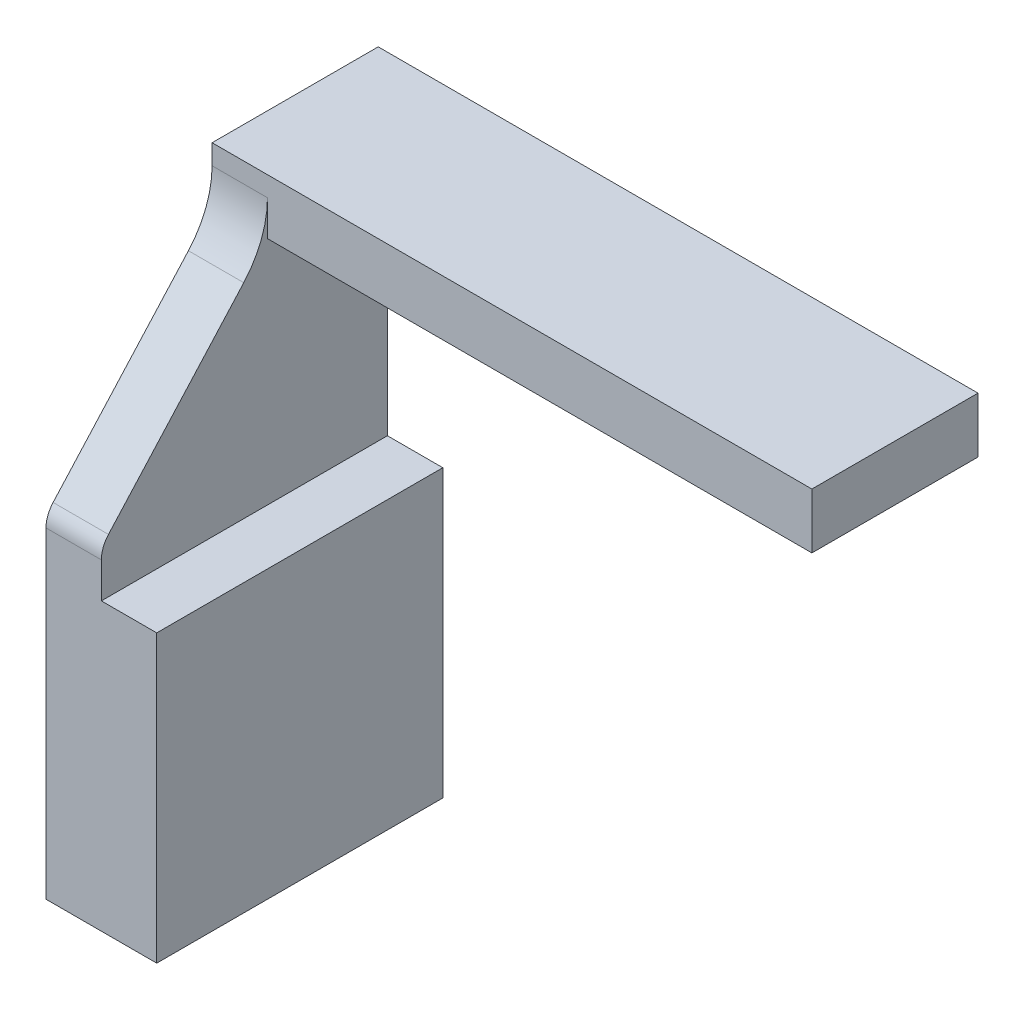
ISO-10303-21;
HEADER;
FILE_DESCRIPTION(('STEP AP214'),'2;1');
FILE_NAME('part.step','',(''),(''),'','','');
FILE_SCHEMA(('AUTOMOTIVE_DESIGN { 1 0 10303 214 1 1 1 1 }'));
ENDSEC;
DATA;
#1=APPLICATION_CONTEXT('core data for automotive mechanical design processes');
#2=APPLICATION_PROTOCOL_DEFINITION('international standard','automotive_design',2000,#1);
#3=PRODUCT_CONTEXT('',#1,'mechanical');
#4=PRODUCT('Part','Part','',(#3));
#5=PRODUCT_RELATED_PRODUCT_CATEGORY('part','',(#4));
#6=PRODUCT_DEFINITION_FORMATION('','',#4);
#7=PRODUCT_DEFINITION_CONTEXT('part definition',#1,'design');
#8=PRODUCT_DEFINITION('design','',#6,#7);
#9=PRODUCT_DEFINITION_SHAPE('','',#8);
#10=(LENGTH_UNIT() NAMED_UNIT(*) SI_UNIT(.MILLI.,.METRE.));
#11=(NAMED_UNIT(*) PLANE_ANGLE_UNIT() SI_UNIT($,.RADIAN.));
#12=(NAMED_UNIT(*) SI_UNIT($,.STERADIAN.) SOLID_ANGLE_UNIT());
#13=UNCERTAINTY_MEASURE_WITH_UNIT(LENGTH_MEASURE(1.E-05),#10,'distance_accuracy_value','');
#14=(GEOMETRIC_REPRESENTATION_CONTEXT(3) GLOBAL_UNCERTAINTY_ASSIGNED_CONTEXT((#13)) GLOBAL_UNIT_ASSIGNED_CONTEXT((#10,
#11,#12)) REPRESENTATION_CONTEXT('',''));
#15=CARTESIAN_POINT('',(0.,0.,0.));
#16=DIRECTION('',(0.,0.,1.));
#17=DIRECTION('',(1.,0.,0.));
#18=AXIS2_PLACEMENT_3D('',#15,#16,#17);
#19=CARTESIAN_POINT('',(-26.5,0.,0.));
#20=DIRECTION('',(1.,0.,0.));
#21=DIRECTION('',(0.,0.,-1.));
#22=AXIS2_PLACEMENT_3D('',#19,#20,#21);
#23=PLANE('',#22);
#24=DIRECTION('',(0.,1.,0.));
#25=VECTOR('',#24,1.);
#26=CARTESIAN_POINT('',(-26.5,-56.,27.));
#27=LINE('',#26,#25);
#28=CARTESIAN_POINT('',(-26.5,-25.,27.));
#29=VERTEX_POINT('',#28);
#30=CARTESIAN_POINT('',(-26.5,-21.1512080156912,27.));
#31=VERTEX_POINT('',#30);
#32=EDGE_CURVE('E171',#29,#31,#27,.T.);
#33=ORIENTED_EDGE('',*,*,#32,.F.);
#34=DIRECTION('',(0.,0.,1.));
#35=VECTOR('',#34,1.);
#36=CARTESIAN_POINT('',(-26.5,-25.,-4.));
#37=LINE('',#36,#35);
#38=CARTESIAN_POINT('',(-26.5,-25.,-4.));
#39=VERTEX_POINT('',#38);
#40=EDGE_CURVE('E158',#39,#29,#37,.T.);
#41=ORIENTED_EDGE('',*,*,#40,.F.);
#42=DIRECTION('',(0.,-1.,0.));
#43=VECTOR('',#42,1.);
#44=CARTESIAN_POINT('',(-26.5,-5.,-4.));
#45=LINE('',#44,#43);
#46=CARTESIAN_POINT('',(-26.5,-6.24264068711929,-4.));
#47=VERTEX_POINT('',#46);
#48=EDGE_CURVE('E161',#47,#39,#45,.T.);
#49=ORIENTED_EDGE('',*,*,#48,.F.);
#50=CARTESIAN_POINT('',(-26.5,-6.24264068711929,-7.));
#51=DIRECTION('',(1.,0.,0.));
#52=DIRECTION('',(0.,0.,-1.));
#53=AXIS2_PLACEMENT_3D('',#50,#51,#52);
#54=CIRCLE('',#53,3.);
#55=CARTESIAN_POINT('',(-26.5,-4.12132034355965,-4.87867965644036));
#56=VERTEX_POINT('',#55);
#57=EDGE_CURVE('E11',#47,#56,#54,.F.);
#58=ORIENTED_EDGE('',*,*,#57,.T.);
#59=DIRECTION('',(0.,-0.707106781186548,0.707106781186547));
#60=VECTOR('',#59,1.);
#61=CARTESIAN_POINT('',(-26.5,0.,-9.));
#62=LINE('',#61,#60);
#63=CARTESIAN_POINT('',(-26.5,0.,-9.));
#64=VERTEX_POINT('',#63);
#65=EDGE_CURVE('E172',#64,#56,#62,.T.);
#66=ORIENTED_EDGE('',*,*,#65,.F.);
#67=DIRECTION('',(0.,0.,-1.));
#68=VECTOR('',#67,1.);
#69=CARTESIAN_POINT('',(-26.5,0.,9.));
#70=LINE('',#69,#68);
#71=CARTESIAN_POINT('',(-26.5,0.,9.));
#72=VERTEX_POINT('',#71);
#73=EDGE_CURVE('E178',#72,#64,#70,.T.);
#74=ORIENTED_EDGE('',*,*,#73,.F.);
#75=DIRECTION('',(0.,-1.,0.));
#76=VECTOR('',#75,1.);
#77=CARTESIAN_POINT('',(-26.5,6.,9.));
#78=LINE('',#77,#76);
#79=CARTESIAN_POINT('',(-26.5,3.83736005230412,9.));
#80=VERTEX_POINT('',#79);
#81=EDGE_CURVE('E199',#80,#72,#78,.T.);
#82=ORIENTED_EDGE('',*,*,#81,.F.);
#83=CARTESIAN_POINT('',(-26.5,3.83736005230412,19.));
#84=DIRECTION('',(1.,0.,0.));
#85=DIRECTION('',(0.,0.,-1.));
#86=AXIS2_PLACEMENT_3D('',#83,#84,#85);
#87=CIRCLE('',#86,10.);
#88=CARTESIAN_POINT('',(-26.5,-2.85228726392038,11.5670585375283));
#89=VERTEX_POINT('',#88);
#90=EDGE_CURVE('E269',#80,#89,#87,.F.);
#91=ORIENTED_EDGE('',*,*,#90,.T.);
#92=DIRECTION('',(0.,0.743294146247166,-0.66896473162245));
#93=VECTOR('',#92,1.);
#94=CARTESIAN_POINT('',(-26.5,-20.,27.));
#95=LINE('',#94,#93);
#96=CARTESIAN_POINT('',(-26.5,-19.1443138208239,26.2298824387415));
#97=VERTEX_POINT('',#96);
#98=EDGE_CURVE('E174',#97,#89,#95,.T.);
#99=ORIENTED_EDGE('',*,*,#98,.F.);
#100=CARTESIAN_POINT('',(-26.5,-21.1512080156912,24.));
#101=DIRECTION('',(1.,0.,0.));
#102=DIRECTION('',(0.,0.,-1.));
#103=AXIS2_PLACEMENT_3D('',#100,#101,#102);
#104=CIRCLE('',#103,3.);
#105=EDGE_CURVE('E208',#97,#31,#104,.T.);
#106=ORIENTED_EDGE('',*,*,#105,.T.);
#107=EDGE_LOOP('',(#33,#41,#49,#58,#66,#74,#82,#91,#99,#106));
#108=FACE_BOUND('',#107,.T.);
#109=ADVANCED_FACE('F35',(#108),#23,.T.);
#110=CARTESIAN_POINT('',(0.,0.,0.));
#111=DIRECTION('',(0.,-1.,0.));
#112=DIRECTION('',(0.,0.,-1.));
#113=AXIS2_PLACEMENT_3D('',#110,#111,#112);
#114=PLANE('',#113);
#115=DIRECTION('',(1.,0.,0.));
#116=VECTOR('',#115,1.);
#117=CARTESIAN_POINT('',(-32.5,0.,9.));
#118=LINE('',#117,#116);
#119=CARTESIAN_POINT('',(32.5,0.,9.));
#120=VERTEX_POINT('',#119);
#121=EDGE_CURVE('E235',#72,#120,#118,.T.);
#122=ORIENTED_EDGE('',*,*,#121,.F.);
#123=ORIENTED_EDGE('',*,*,#73,.T.);
#124=DIRECTION('',(-1.,0.,0.));
#125=VECTOR('',#124,1.);
#126=CARTESIAN_POINT('',(-32.5,0.,-9.));
#127=LINE('',#126,#125);
#128=CARTESIAN_POINT('',(32.5,0.,-9.));
#129=VERTEX_POINT('',#128);
#130=EDGE_CURVE('E183',#129,#64,#127,.T.);
#131=ORIENTED_EDGE('',*,*,#130,.F.);
#132=DIRECTION('',(0.,0.,-1.));
#133=VECTOR('',#132,1.);
#134=CARTESIAN_POINT('',(32.5,0.,9.));
#135=LINE('',#134,#133);
#136=EDGE_CURVE('E193',#120,#129,#135,.T.);
#137=ORIENTED_EDGE('',*,*,#136,.F.);
#138=EDGE_LOOP('',(#122,#123,#131,#137));
#139=FACE_BOUND('',#138,.T.);
#140=ADVANCED_FACE('F236',(#139),#114,.T.);
#141=CARTESIAN_POINT('',(32.5,6.,9.));
#142=DIRECTION('',(-1.,0.,0.));
#143=DIRECTION('',(0.,0.,1.));
#144=AXIS2_PLACEMENT_3D('',#141,#142,#143);
#145=PLANE('',#144);
#146=ORIENTED_EDGE('',*,*,#136,.T.);
#147=DIRECTION('',(0.,-1.,0.));
#148=VECTOR('',#147,1.);
#149=CARTESIAN_POINT('',(32.5,6.,-9.));
#150=LINE('',#149,#148);
#151=CARTESIAN_POINT('',(32.5,6.,-9.));
#152=VERTEX_POINT('',#151);
#153=EDGE_CURVE('E247',#152,#129,#150,.T.);
#154=ORIENTED_EDGE('',*,*,#153,.F.);
#155=DIRECTION('',(0.,0.,-1.));
#156=VECTOR('',#155,1.);
#157=CARTESIAN_POINT('',(32.5,6.,9.));
#158=LINE('',#157,#156);
#159=CARTESIAN_POINT('',(32.5,6.,9.));
#160=VERTEX_POINT('',#159);
#161=EDGE_CURVE('E241',#160,#152,#158,.T.);
#162=ORIENTED_EDGE('',*,*,#161,.F.);
#163=DIRECTION('',(0.,-1.,0.));
#164=VECTOR('',#163,1.);
#165=CARTESIAN_POINT('',(32.5,6.,9.));
#166=LINE('',#165,#164);
#167=EDGE_CURVE('E253',#160,#120,#166,.T.);
#168=ORIENTED_EDGE('',*,*,#167,.T.);
#169=EDGE_LOOP('',(#146,#154,#162,#168));
#170=FACE_BOUND('',#169,.T.);
#171=ADVANCED_FACE('F304',(#170),#145,.F.);
#172=CARTESIAN_POINT('',(-32.5,6.,-9.));
#173=DIRECTION('',(0.,0.,1.));
#174=DIRECTION('',(1.,0.,0.));
#175=AXIS2_PLACEMENT_3D('',#172,#173,#174);
#176=PLANE('',#175);
#177=ORIENTED_EDGE('',*,*,#130,.T.);
#178=DIRECTION('',(-1.,0.,0.));
#179=VECTOR('',#178,1.);
#180=CARTESIAN_POINT('',(-26.5,0.,-9.));
#181=LINE('',#180,#179);
#182=CARTESIAN_POINT('',(-32.5,0.,-9.));
#183=VERTEX_POINT('',#182);
#184=EDGE_CURVE('E190',#64,#183,#181,.T.);
#185=ORIENTED_EDGE('',*,*,#184,.T.);
#186=DIRECTION('',(0.,-1.,0.));
#187=VECTOR('',#186,1.);
#188=CARTESIAN_POINT('',(-32.5,6.,-9.));
#189=LINE('',#188,#187);
#190=CARTESIAN_POINT('',(-32.5,6.,-9.));
#191=VERTEX_POINT('',#190);
#192=EDGE_CURVE('E258',#191,#183,#189,.T.);
#193=ORIENTED_EDGE('',*,*,#192,.F.);
#194=DIRECTION('',(-1.,0.,0.));
#195=VECTOR('',#194,1.);
#196=CARTESIAN_POINT('',(-32.5,6.,-9.));
#197=LINE('',#196,#195);
#198=EDGE_CURVE('E243',#152,#191,#197,.T.);
#199=ORIENTED_EDGE('',*,*,#198,.F.);
#200=ORIENTED_EDGE('',*,*,#153,.T.);
#201=EDGE_LOOP('',(#177,#185,#193,#199,#200));
#202=FACE_BOUND('',#201,.T.);
#203=ADVANCED_FACE('F306',(#202),#176,.F.);
#204=CARTESIAN_POINT('',(-32.5,6.,9.));
#205=DIRECTION('',(1.,0.,0.));
#206=DIRECTION('',(0.,0.,-1.));
#207=AXIS2_PLACEMENT_3D('',#204,#205,#206);
#208=PLANE('',#207);
#209=DIRECTION('',(0.,1.,0.));
#210=VECTOR('',#209,1.);
#211=CARTESIAN_POINT('',(-32.5,-56.,27.));
#212=LINE('',#211,#210);
#213=CARTESIAN_POINT('',(-32.5,-56.,27.));
#214=VERTEX_POINT('',#213);
#215=CARTESIAN_POINT('',(-32.5,-21.1512080156912,27.));
#216=VERTEX_POINT('',#215);
#217=EDGE_CURVE('E281',#214,#216,#212,.T.);
#218=ORIENTED_EDGE('',*,*,#217,.T.);
#219=CARTESIAN_POINT('',(-32.5,-21.1512080156912,24.));
#220=DIRECTION('',(1.,0.,0.));
#221=DIRECTION('',(0.,0.,-1.));
#222=AXIS2_PLACEMENT_3D('',#219,#220,#221);
#223=CIRCLE('',#222,3.);
#224=CARTESIAN_POINT('',(-32.5,-19.1443138208239,26.2298824387415));
#225=VERTEX_POINT('',#224);
#226=EDGE_CURVE('E204',#216,#225,#223,.F.);
#227=ORIENTED_EDGE('',*,*,#226,.T.);
#228=DIRECTION('',(0.,0.743294146247166,-0.66896473162245));
#229=VECTOR('',#228,1.);
#230=CARTESIAN_POINT('',(-32.5,-20.,27.));
#231=LINE('',#230,#229);
#232=CARTESIAN_POINT('',(-32.5,-2.85228726392038,11.5670585375283));
#233=VERTEX_POINT('',#232);
#234=EDGE_CURVE('E187',#225,#233,#231,.T.);
#235=ORIENTED_EDGE('',*,*,#234,.T.);
#236=CARTESIAN_POINT('',(-32.5,3.83736005230412,19.));
#237=DIRECTION('',(1.,0.,0.));
#238=DIRECTION('',(0.,0.,-1.));
#239=AXIS2_PLACEMENT_3D('',#236,#237,#238);
#240=CIRCLE('',#239,10.);
#241=CARTESIAN_POINT('',(-32.5,3.83736005230412,9.));
#242=VERTEX_POINT('',#241);
#243=EDGE_CURVE('E274',#233,#242,#240,.T.);
#244=ORIENTED_EDGE('',*,*,#243,.T.);
#245=DIRECTION('',(0.,-1.,0.));
#246=VECTOR('',#245,1.);
#247=CARTESIAN_POINT('',(-32.5,6.,9.));
#248=LINE('',#247,#246);
#249=CARTESIAN_POINT('',(-32.5,6.,9.));
#250=VERTEX_POINT('',#249);
#251=EDGE_CURVE('E255',#250,#242,#248,.T.);
#252=ORIENTED_EDGE('',*,*,#251,.F.);
#253=DIRECTION('',(0.,0.,1.));
#254=VECTOR('',#253,1.);
#255=CARTESIAN_POINT('',(-32.5,6.,9.));
#256=LINE('',#255,#254);
#257=EDGE_CURVE('E299',#191,#250,#256,.T.);
#258=ORIENTED_EDGE('',*,*,#257,.F.);
#259=ORIENTED_EDGE('',*,*,#192,.T.);
#260=DIRECTION('',(0.,-0.707106781186548,0.707106781186547));
#261=VECTOR('',#260,1.);
#262=CARTESIAN_POINT('',(-32.5,0.,-9.));
#263=LINE('',#262,#261);
#264=CARTESIAN_POINT('',(-32.5,-4.12132034355965,-4.87867965644036));
#265=VERTEX_POINT('',#264);
#266=EDGE_CURVE('E162',#183,#265,#263,.T.);
#267=ORIENTED_EDGE('',*,*,#266,.T.);
#268=CARTESIAN_POINT('',(-32.5,-6.24264068711929,-7.));
#269=DIRECTION('',(1.,0.,0.));
#270=DIRECTION('',(0.,0.,-1.));
#271=AXIS2_PLACEMENT_3D('',#268,#269,#270);
#272=CIRCLE('',#271,3.);
#273=CARTESIAN_POINT('',(-32.5,-6.24264068711929,-4.));
#274=VERTEX_POINT('',#273);
#275=EDGE_CURVE('E43',#265,#274,#272,.T.);
#276=ORIENTED_EDGE('',*,*,#275,.T.);
#277=DIRECTION('',(0.,-1.,0.));
#278=VECTOR('',#277,1.);
#279=CARTESIAN_POINT('',(-32.5,-5.,-4.));
#280=LINE('',#279,#278);
#281=CARTESIAN_POINT('',(-32.5,-56.,-4.));
#282=VERTEX_POINT('',#281);
#283=EDGE_CURVE('E165',#274,#282,#280,.T.);
#284=ORIENTED_EDGE('',*,*,#283,.T.);
#285=DIRECTION('',(0.,0.,1.));
#286=VECTOR('',#285,1.);
#287=CARTESIAN_POINT('',(-32.5,-56.,-4.));
#288=LINE('',#287,#286);
#289=EDGE_CURVE('E222',#282,#214,#288,.T.);
#290=ORIENTED_EDGE('',*,*,#289,.T.);
#291=EDGE_LOOP('',(#218,#227,#235,#244,#252,#258,#259,#267,#276,#284,#290));
#292=FACE_BOUND('',#291,.T.);
#293=ADVANCED_FACE('F216',(#292),#208,.F.);
#294=CARTESIAN_POINT('',(-32.5,6.,9.));
#295=DIRECTION('',(0.,0.,-1.));
#296=DIRECTION('',(-1.,0.,0.));
#297=AXIS2_PLACEMENT_3D('',#294,#295,#296);
#298=PLANE('',#297);
#299=ORIENTED_EDGE('',*,*,#251,.T.);
#300=DIRECTION('',(1.,0.,0.));
#301=VECTOR('',#300,1.);
#302=CARTESIAN_POINT('',(-32.5,3.83736005230412,9.));
#303=LINE('',#302,#301);
#304=EDGE_CURVE('E264',#242,#80,#303,.T.);
#305=ORIENTED_EDGE('',*,*,#304,.T.);
#306=ORIENTED_EDGE('',*,*,#81,.T.);
#307=ORIENTED_EDGE('',*,*,#121,.T.);
#308=ORIENTED_EDGE('',*,*,#167,.F.);
#309=DIRECTION('',(1.,0.,0.));
#310=VECTOR('',#309,1.);
#311=CARTESIAN_POINT('',(-32.5,6.,9.));
#312=LINE('',#311,#310);
#313=EDGE_CURVE('E256',#250,#160,#312,.T.);
#314=ORIENTED_EDGE('',*,*,#313,.F.);
#315=EDGE_LOOP('',(#299,#305,#306,#307,#308,#314));
#316=FACE_BOUND('',#315,.T.);
#317=ADVANCED_FACE('F296',(#316),#298,.F.);
#318=CARTESIAN_POINT('',(0.,6.,0.));
#319=DIRECTION('',(0.,-1.,0.));
#320=DIRECTION('',(0.,0.,-1.));
#321=AXIS2_PLACEMENT_3D('',#318,#319,#320);
#322=PLANE('',#321);
#323=ORIENTED_EDGE('',*,*,#161,.T.);
#324=ORIENTED_EDGE('',*,*,#198,.T.);
#325=ORIENTED_EDGE('',*,*,#257,.T.);
#326=ORIENTED_EDGE('',*,*,#313,.T.);
#327=EDGE_LOOP('',(#323,#324,#325,#326));
#328=FACE_BOUND('',#327,.T.);
#329=ADVANCED_FACE('F305',(#328),#322,.F.);
#330=CARTESIAN_POINT('',(-26.5,0.,-9.));
#331=DIRECTION('',(0.,-0.707106781186547,-0.707106781186548));
#332=DIRECTION('',(0.,0.707106781186548,-0.707106781186547));
#333=AXIS2_PLACEMENT_3D('',#330,#331,#332);
#334=PLANE('',#333);
#335=ORIENTED_EDGE('',*,*,#65,.T.);
#336=DIRECTION('',(-1.,0.,0.));
#337=VECTOR('',#336,1.);
#338=CARTESIAN_POINT('',(-32.5,-4.12132034355965,-4.87867965644036));
#339=LINE('',#338,#337);
#340=EDGE_CURVE('E211',#56,#265,#339,.T.);
#341=ORIENTED_EDGE('',*,*,#340,.T.);
#342=ORIENTED_EDGE('',*,*,#266,.F.);
#343=ORIENTED_EDGE('',*,*,#184,.F.);
#344=EDGE_LOOP('',(#335,#341,#342,#343));
#345=FACE_BOUND('',#344,.T.);
#346=ADVANCED_FACE('F224',(#345),#334,.T.);
#347=CARTESIAN_POINT('',(-26.5,-20.,27.));
#348=DIRECTION('',(0.,0.66896473162245,0.743294146247166));
#349=DIRECTION('',(0.,-0.743294146247166,0.66896473162245));
#350=AXIS2_PLACEMENT_3D('',#347,#348,#349);
#351=PLANE('',#350);
#352=ORIENTED_EDGE('',*,*,#234,.F.);
#353=DIRECTION('',(-1.,0.,0.));
#354=VECTOR('',#353,1.);
#355=CARTESIAN_POINT('',(-26.5,-19.1443138208239,26.2298824387415));
#356=LINE('',#355,#354);
#357=EDGE_CURVE('E206',#225,#97,#356,.F.);
#358=ORIENTED_EDGE('',*,*,#357,.T.);
#359=ORIENTED_EDGE('',*,*,#98,.T.);
#360=DIRECTION('',(1.,0.,0.));
#361=VECTOR('',#360,1.);
#362=CARTESIAN_POINT('',(-26.5,-2.85228726392038,11.5670585375283));
#363=LINE('',#362,#361);
#364=EDGE_CURVE('E265',#89,#233,#363,.F.);
#365=ORIENTED_EDGE('',*,*,#364,.T.);
#366=EDGE_LOOP('',(#352,#358,#359,#365));
#367=FACE_BOUND('',#366,.T.);
#368=ADVANCED_FACE('F285',(#367),#351,.T.);
#369=CARTESIAN_POINT('',(-26.5,-56.,27.));
#370=DIRECTION('',(0.,0.,1.));
#371=DIRECTION('',(1.,0.,0.));
#372=AXIS2_PLACEMENT_3D('',#369,#370,#371);
#373=PLANE('',#372);
#374=DIRECTION('',(-1.,0.,0.));
#375=VECTOR('',#374,1.);
#376=CARTESIAN_POINT('',(-26.5,-56.,27.));
#377=LINE('',#376,#375);
#378=CARTESIAN_POINT('',(-20.5,-56.,27.));
#379=VERTEX_POINT('',#378);
#380=EDGE_CURVE('E194',#379,#214,#377,.T.);
#381=ORIENTED_EDGE('',*,*,#380,.F.);
#382=DIRECTION('',(0.,-1.,0.));
#383=VECTOR('',#382,1.);
#384=CARTESIAN_POINT('',(-20.5,-56.,27.));
#385=LINE('',#384,#383);
#386=CARTESIAN_POINT('',(-20.5,-25.,27.));
#387=VERTEX_POINT('',#386);
#388=EDGE_CURVE('E149',#387,#379,#385,.T.);
#389=ORIENTED_EDGE('',*,*,#388,.F.);
#390=DIRECTION('',(-1.,0.,0.));
#391=VECTOR('',#390,1.);
#392=CARTESIAN_POINT('',(-20.5,-25.,27.));
#393=LINE('',#392,#391);
#394=EDGE_CURVE('E145',#387,#29,#393,.T.);
#395=ORIENTED_EDGE('',*,*,#394,.T.);
#396=ORIENTED_EDGE('',*,*,#32,.T.);
#397=DIRECTION('',(-1.,0.,0.));
#398=VECTOR('',#397,1.);
#399=CARTESIAN_POINT('',(-26.5,-21.1512080156912,27.));
#400=LINE('',#399,#398);
#401=EDGE_CURVE('E275',#31,#216,#400,.T.);
#402=ORIENTED_EDGE('',*,*,#401,.T.);
#403=ORIENTED_EDGE('',*,*,#217,.F.);
#404=EDGE_LOOP('',(#381,#389,#395,#396,#402,#403));
#405=FACE_BOUND('',#404,.T.);
#406=ADVANCED_FACE('F326',(#405),#373,.T.);
#407=CARTESIAN_POINT('',(-26.5,-56.,-4.));
#408=DIRECTION('',(0.,-1.,0.));
#409=DIRECTION('',(0.,0.,-1.));
#410=AXIS2_PLACEMENT_3D('',#407,#408,#409);
#411=PLANE('',#410);
#412=ORIENTED_EDGE('',*,*,#289,.F.);
#413=DIRECTION('',(-1.,0.,0.));
#414=VECTOR('',#413,1.);
#415=CARTESIAN_POINT('',(-26.5,-56.,-4.));
#416=LINE('',#415,#414);
#417=CARTESIAN_POINT('',(-20.5,-56.,-4.));
#418=VERTEX_POINT('',#417);
#419=EDGE_CURVE('E182',#418,#282,#416,.T.);
#420=ORIENTED_EDGE('',*,*,#419,.F.);
#421=DIRECTION('',(0.,0.,-1.));
#422=VECTOR('',#421,1.);
#423=CARTESIAN_POINT('',(-20.5,-56.,-4.));
#424=LINE('',#423,#422);
#425=EDGE_CURVE('E156',#379,#418,#424,.T.);
#426=ORIENTED_EDGE('',*,*,#425,.F.);
#427=ORIENTED_EDGE('',*,*,#380,.T.);
#428=EDGE_LOOP('',(#412,#420,#426,#427));
#429=FACE_BOUND('',#428,.T.);
#430=ADVANCED_FACE('F329',(#429),#411,.T.);
#431=CARTESIAN_POINT('',(-26.5,-5.,-4.));
#432=DIRECTION('',(0.,0.,-1.));
#433=DIRECTION('',(0.,1.,0.));
#434=AXIS2_PLACEMENT_3D('',#431,#432,#433);
#435=PLANE('',#434);
#436=ORIENTED_EDGE('',*,*,#283,.F.);
#437=DIRECTION('',(-1.,0.,0.));
#438=VECTOR('',#437,1.);
#439=CARTESIAN_POINT('',(-26.5,-6.24264068711929,-4.));
#440=LINE('',#439,#438);
#441=EDGE_CURVE('E50',#274,#47,#440,.F.);
#442=ORIENTED_EDGE('',*,*,#441,.T.);
#443=ORIENTED_EDGE('',*,*,#48,.T.);
#444=DIRECTION('',(-1.,0.,0.));
#445=VECTOR('',#444,1.);
#446=CARTESIAN_POINT('',(-20.5,-25.,-4.));
#447=LINE('',#446,#445);
#448=CARTESIAN_POINT('',(-20.5,-25.,-4.));
#449=VERTEX_POINT('',#448);
#450=EDGE_CURVE('E142',#449,#39,#447,.T.);
#451=ORIENTED_EDGE('',*,*,#450,.F.);
#452=DIRECTION('',(0.,1.,0.));
#453=VECTOR('',#452,1.);
#454=CARTESIAN_POINT('',(-20.5,-56.,-4.));
#455=LINE('',#454,#453);
#456=EDGE_CURVE('E150',#418,#449,#455,.T.);
#457=ORIENTED_EDGE('',*,*,#456,.F.);
#458=ORIENTED_EDGE('',*,*,#419,.T.);
#459=EDGE_LOOP('',(#436,#442,#443,#451,#457,#458));
#460=FACE_BOUND('',#459,.T.);
#461=ADVANCED_FACE('F160',(#460),#435,.T.);
#462=CARTESIAN_POINT('',(-32.5,3.83736005230412,19.));
#463=DIRECTION('',(1.,0.,0.));
#464=DIRECTION('',(0.,0.,-1.));
#465=AXIS2_PLACEMENT_3D('',#462,#463,#464);
#466=CYLINDRICAL_SURFACE('',#465,10.);
#467=ORIENTED_EDGE('',*,*,#243,.F.);
#468=ORIENTED_EDGE('',*,*,#364,.F.);
#469=ORIENTED_EDGE('',*,*,#90,.F.);
#470=ORIENTED_EDGE('',*,*,#304,.F.);
#471=EDGE_LOOP('',(#467,#468,#469,#470));
#472=FACE_BOUND('',#471,.T.);
#473=ADVANCED_FACE('F293',(#472),#466,.F.);
#474=CARTESIAN_POINT('',(-26.5,-21.1512080156912,24.));
#475=DIRECTION('',(-1.,0.,0.));
#476=DIRECTION('',(0.,0.,1.));
#477=AXIS2_PLACEMENT_3D('',#474,#475,#476);
#478=CYLINDRICAL_SURFACE('',#477,3.);
#479=ORIENTED_EDGE('',*,*,#105,.F.);
#480=ORIENTED_EDGE('',*,*,#357,.F.);
#481=ORIENTED_EDGE('',*,*,#226,.F.);
#482=ORIENTED_EDGE('',*,*,#401,.F.);
#483=EDGE_LOOP('',(#479,#480,#481,#482));
#484=FACE_BOUND('',#483,.T.);
#485=ADVANCED_FACE('F291',(#484),#478,.T.);
#486=CARTESIAN_POINT('',(-26.5,-6.24264068711929,-7.));
#487=DIRECTION('',(1.,0.,0.));
#488=DIRECTION('',(0.,0.,-1.));
#489=AXIS2_PLACEMENT_3D('',#486,#487,#488);
#490=CYLINDRICAL_SURFACE('',#489,3.);
#491=ORIENTED_EDGE('',*,*,#57,.F.);
#492=ORIENTED_EDGE('',*,*,#441,.F.);
#493=ORIENTED_EDGE('',*,*,#275,.F.);
#494=ORIENTED_EDGE('',*,*,#340,.F.);
#495=EDGE_LOOP('',(#491,#492,#493,#494));
#496=FACE_BOUND('',#495,.T.);
#497=ADVANCED_FACE('F37',(#496),#490,.F.);
#498=CARTESIAN_POINT('',(-20.5,-25.,-4.));
#499=DIRECTION('',(0.,-1.,0.));
#500=DIRECTION('',(0.,0.,-1.));
#501=AXIS2_PLACEMENT_3D('',#498,#499,#500);
#502=PLANE('',#501);
#503=ORIENTED_EDGE('',*,*,#40,.T.);
#504=ORIENTED_EDGE('',*,*,#394,.F.);
#505=DIRECTION('',(0.,0.,1.));
#506=VECTOR('',#505,1.);
#507=CARTESIAN_POINT('',(-20.5,-25.,-4.));
#508=LINE('',#507,#506);
#509=EDGE_CURVE('E138',#449,#387,#508,.T.);
#510=ORIENTED_EDGE('',*,*,#509,.F.);
#511=ORIENTED_EDGE('',*,*,#450,.T.);
#512=EDGE_LOOP('',(#503,#504,#510,#511));
#513=FACE_BOUND('',#512,.T.);
#514=ADVANCED_FACE('F140',(#513),#502,.F.);
#515=CARTESIAN_POINT('',(-20.5,0.,0.));
#516=DIRECTION('',(1.,0.,0.));
#517=DIRECTION('',(0.,0.,-1.));
#518=AXIS2_PLACEMENT_3D('',#515,#516,#517);
#519=PLANE('',#518);
#520=ORIENTED_EDGE('',*,*,#456,.T.);
#521=ORIENTED_EDGE('',*,*,#509,.T.);
#522=ORIENTED_EDGE('',*,*,#388,.T.);
#523=ORIENTED_EDGE('',*,*,#425,.T.);
#524=EDGE_LOOP('',(#520,#521,#522,#523));
#525=FACE_BOUND('',#524,.T.);
#526=ADVANCED_FACE('F154',(#525),#519,.T.);
#527=CLOSED_SHELL('',(#109,#140,#171,#203,#293,#317,#329,#346,#368,#406,#430,#461,#473,#485,
#497,#514,#526));
#528=MANIFOLD_SOLID_BREP('B2',#527);
#529=ADVANCED_BREP_SHAPE_REPRESENTATION('',(#18,#528),#14);
#530=SHAPE_DEFINITION_REPRESENTATION(#9,#529);
ENDSEC;
END-ISO-10303-21;
